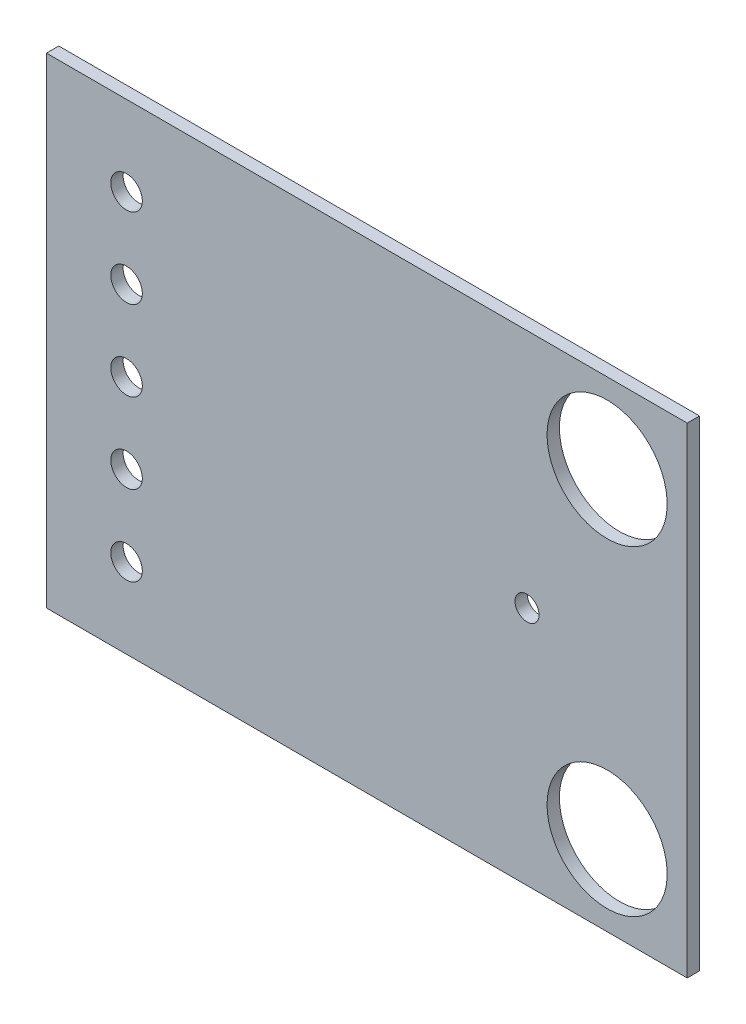
ISO-10303-21;
HEADER;
FILE_DESCRIPTION(('STEP AP214'),'2;1');
FILE_NAME('part.step','',(''),(''),'','','');
FILE_SCHEMA(('AUTOMOTIVE_DESIGN { 1 0 10303 214 1 1 1 1 }'));
ENDSEC;
DATA;
#1=APPLICATION_CONTEXT('core data for automotive mechanical design processes');
#2=APPLICATION_PROTOCOL_DEFINITION('international standard','automotive_design',2000,#1);
#3=PRODUCT_CONTEXT('',#1,'mechanical');
#4=PRODUCT('Part','Part','',(#3));
#5=PRODUCT_RELATED_PRODUCT_CATEGORY('part','',(#4));
#6=PRODUCT_DEFINITION_FORMATION('','',#4);
#7=PRODUCT_DEFINITION_CONTEXT('part definition',#1,'design');
#8=PRODUCT_DEFINITION('design','',#6,#7);
#9=PRODUCT_DEFINITION_SHAPE('','',#8);
#10=(LENGTH_UNIT() NAMED_UNIT(*) SI_UNIT(.MILLI.,.METRE.));
#11=(NAMED_UNIT(*) PLANE_ANGLE_UNIT() SI_UNIT($,.RADIAN.));
#12=(NAMED_UNIT(*) SI_UNIT($,.STERADIAN.) SOLID_ANGLE_UNIT());
#13=UNCERTAINTY_MEASURE_WITH_UNIT(LENGTH_MEASURE(1.E-05),#10,'distance_accuracy_value','');
#14=(GEOMETRIC_REPRESENTATION_CONTEXT(3) GLOBAL_UNCERTAINTY_ASSIGNED_CONTEXT((#13)) GLOBAL_UNIT_ASSIGNED_CONTEXT((#10,
#11,#12)) REPRESENTATION_CONTEXT('',''));
#15=CARTESIAN_POINT('',(0.,0.,0.));
#16=DIRECTION('',(0.,0.,1.));
#17=DIRECTION('',(1.,0.,0.));
#18=AXIS2_PLACEMENT_3D('',#15,#16,#17);
#19=CARTESIAN_POINT('',(0.,0.,0.39116));
#20=DIRECTION('',(0.,0.,-1.));
#21=DIRECTION('',(-1.,0.,0.));
#22=AXIS2_PLACEMENT_3D('',#19,#20,#21);
#23=PLANE('',#22);
#24=CARTESIAN_POINT('',(17.78,12.7,0.39116));
#25=DIRECTION('',(0.,0.,-1.));
#26=DIRECTION('',(-1.,0.,0.));
#27=AXIS2_PLACEMENT_3D('',#24,#25,#26);
#28=CIRCLE('',#27,1.905);
#29=CARTESIAN_POINT('',(15.875,12.7,0.39116));
#30=VERTEX_POINT('',#29);
#31=EDGE_CURVE('E103',#30,#30,#28,.T.);
#32=ORIENTED_EDGE('',*,*,#31,.T.);
#33=EDGE_LOOP('',(#32));
#34=FACE_BOUND('',#33,.T.);
#35=CARTESIAN_POINT('',(2.54,12.7,0.39116));
#36=DIRECTION('',(0.,0.,-1.));
#37=DIRECTION('',(-1.,0.,0.));
#38=AXIS2_PLACEMENT_3D('',#35,#36,#37);
#39=CIRCLE('',#38,0.499999);
#40=CARTESIAN_POINT('',(2.040001,12.7,0.39116));
#41=VERTEX_POINT('',#40);
#42=EDGE_CURVE('E107',#41,#41,#39,.T.);
#43=ORIENTED_EDGE('',*,*,#42,.T.);
#44=EDGE_LOOP('',(#43));
#45=FACE_BOUND('',#44,.T.);
#46=CARTESIAN_POINT('',(17.78,2.54,0.39116));
#47=DIRECTION('',(0.,0.,-1.));
#48=DIRECTION('',(-1.,0.,0.));
#49=AXIS2_PLACEMENT_3D('',#46,#47,#48);
#50=CIRCLE('',#49,1.905);
#51=CARTESIAN_POINT('',(15.875,2.54,0.39116));
#52=VERTEX_POINT('',#51);
#53=EDGE_CURVE('E110',#52,#52,#50,.T.);
#54=ORIENTED_EDGE('',*,*,#53,.T.);
#55=EDGE_LOOP('',(#54));
#56=FACE_BOUND('',#55,.T.);
#57=CARTESIAN_POINT('',(15.24,7.62,0.39116));
#58=DIRECTION('',(0.,0.,-1.));
#59=DIRECTION('',(-1.,0.,0.));
#60=AXIS2_PLACEMENT_3D('',#57,#58,#59);
#61=CIRCLE('',#60,0.381);
#62=CARTESIAN_POINT('',(14.859,7.62,0.39116));
#63=VERTEX_POINT('',#62);
#64=EDGE_CURVE('E113',#63,#63,#61,.T.);
#65=ORIENTED_EDGE('',*,*,#64,.T.);
#66=EDGE_LOOP('',(#65));
#67=FACE_BOUND('',#66,.T.);
#68=CARTESIAN_POINT('',(2.54,7.62,0.39116));
#69=DIRECTION('',(0.,0.,-1.));
#70=DIRECTION('',(-1.,0.,0.));
#71=AXIS2_PLACEMENT_3D('',#68,#69,#70);
#72=CIRCLE('',#71,0.499999);
#73=CARTESIAN_POINT('',(2.040001,7.62,0.39116));
#74=VERTEX_POINT('',#73);
#75=EDGE_CURVE('E116',#74,#74,#72,.T.);
#76=ORIENTED_EDGE('',*,*,#75,.T.);
#77=EDGE_LOOP('',(#76));
#78=FACE_BOUND('',#77,.T.);
#79=CARTESIAN_POINT('',(2.54,10.16,0.39116));
#80=DIRECTION('',(0.,0.,-1.));
#81=DIRECTION('',(-1.,0.,0.));
#82=AXIS2_PLACEMENT_3D('',#79,#80,#81);
#83=CIRCLE('',#82,0.499999);
#84=CARTESIAN_POINT('',(2.040001,10.16,0.39116));
#85=VERTEX_POINT('',#84);
#86=EDGE_CURVE('E119',#85,#85,#83,.T.);
#87=ORIENTED_EDGE('',*,*,#86,.T.);
#88=EDGE_LOOP('',(#87));
#89=FACE_BOUND('',#88,.T.);
#90=CARTESIAN_POINT('',(2.54,2.54,0.39116));
#91=DIRECTION('',(0.,0.,-1.));
#92=DIRECTION('',(-1.,0.,0.));
#93=AXIS2_PLACEMENT_3D('',#90,#91,#92);
#94=CIRCLE('',#93,0.499999);
#95=CARTESIAN_POINT('',(2.040001,2.54,0.39116));
#96=VERTEX_POINT('',#95);
#97=EDGE_CURVE('E121',#96,#96,#94,.T.);
#98=ORIENTED_EDGE('',*,*,#97,.T.);
#99=EDGE_LOOP('',(#98));
#100=FACE_BOUND('',#99,.T.);
#101=CARTESIAN_POINT('',(2.54,5.08,0.39116));
#102=DIRECTION('',(0.,0.,-1.));
#103=DIRECTION('',(-1.,0.,0.));
#104=AXIS2_PLACEMENT_3D('',#101,#102,#103);
#105=CIRCLE('',#104,0.499999);
#106=CARTESIAN_POINT('',(2.040001,5.08,0.39116));
#107=VERTEX_POINT('',#106);
#108=EDGE_CURVE('E20',#107,#107,#105,.T.);
#109=ORIENTED_EDGE('',*,*,#108,.T.);
#110=EDGE_LOOP('',(#109));
#111=FACE_BOUND('',#110,.T.);
#112=DIRECTION('',(0.,1.,0.));
#113=VECTOR('',#112,1.);
#114=CARTESIAN_POINT('',(20.32,0.,0.39116));
#115=LINE('',#114,#113);
#116=CARTESIAN_POINT('',(20.32,0.,0.39116));
#117=VERTEX_POINT('',#116);
#118=CARTESIAN_POINT('',(20.32,15.24,0.39116));
#119=VERTEX_POINT('',#118);
#120=EDGE_CURVE('E55',#117,#119,#115,.T.);
#121=ORIENTED_EDGE('',*,*,#120,.T.);
#122=DIRECTION('',(1.,0.,0.));
#123=VECTOR('',#122,1.);
#124=CARTESIAN_POINT('',(20.32,15.24,0.39116));
#125=LINE('',#124,#123);
#126=CARTESIAN_POINT('',(0.,15.24,0.39116));
#127=VERTEX_POINT('',#126);
#128=EDGE_CURVE('E57',#119,#127,#125,.F.);
#129=ORIENTED_EDGE('',*,*,#128,.T.);
#130=DIRECTION('',(0.,1.,0.));
#131=VECTOR('',#130,1.);
#132=CARTESIAN_POINT('',(0.,15.24,0.39116));
#133=LINE('',#132,#131);
#134=CARTESIAN_POINT('',(0.,0.,0.39116));
#135=VERTEX_POINT('',#134);
#136=EDGE_CURVE('E59',#127,#135,#133,.F.);
#137=ORIENTED_EDGE('',*,*,#136,.T.);
#138=DIRECTION('',(1.,0.,0.));
#139=VECTOR('',#138,1.);
#140=CARTESIAN_POINT('',(0.,0.,0.39116));
#141=LINE('',#140,#139);
#142=EDGE_CURVE('E128',#135,#117,#141,.T.);
#143=ORIENTED_EDGE('',*,*,#142,.T.);
#144=EDGE_LOOP('',(#121,#129,#137,#143));
#145=FACE_BOUND('',#144,.T.);
#146=ADVANCED_FACE('F17',(#34,#45,#56,#67,#78,#89,#100,#111,#145),#23,.F.);
#147=CARTESIAN_POINT('',(0.,15.24,0.));
#148=DIRECTION('',(1.,0.,0.));
#149=DIRECTION('',(0.,0.,-1.));
#150=AXIS2_PLACEMENT_3D('',#147,#148,#149);
#151=PLANE('',#150);
#152=DIRECTION('',(0.,0.,1.));
#153=VECTOR('',#152,1.);
#154=CARTESIAN_POINT('',(0.,0.,0.));
#155=LINE('',#154,#153);
#156=CARTESIAN_POINT('',(0.,0.,0.));
#157=VERTEX_POINT('',#156);
#158=EDGE_CURVE('E70',#157,#135,#155,.T.);
#159=ORIENTED_EDGE('',*,*,#158,.T.);
#160=ORIENTED_EDGE('',*,*,#136,.F.);
#161=DIRECTION('',(0.,0.,-1.));
#162=VECTOR('',#161,1.);
#163=CARTESIAN_POINT('',(0.,15.24,0.));
#164=LINE('',#163,#162);
#165=CARTESIAN_POINT('',(0.,15.24,0.));
#166=VERTEX_POINT('',#165);
#167=EDGE_CURVE('E64',#127,#166,#164,.T.);
#168=ORIENTED_EDGE('',*,*,#167,.T.);
#169=DIRECTION('',(0.,1.,0.));
#170=VECTOR('',#169,1.);
#171=CARTESIAN_POINT('',(0.,0.,0.));
#172=LINE('',#171,#170);
#173=EDGE_CURVE('E106',#157,#166,#172,.T.);
#174=ORIENTED_EDGE('',*,*,#173,.F.);
#175=EDGE_LOOP('',(#159,#160,#168,#174));
#176=FACE_BOUND('',#175,.T.);
#177=ADVANCED_FACE('F67',(#176),#151,.F.);
#178=CARTESIAN_POINT('',(20.32,15.24,0.));
#179=DIRECTION('',(0.,-1.,0.));
#180=DIRECTION('',(0.,0.,-1.));
#181=AXIS2_PLACEMENT_3D('',#178,#179,#180);
#182=PLANE('',#181);
#183=ORIENTED_EDGE('',*,*,#167,.F.);
#184=ORIENTED_EDGE('',*,*,#128,.F.);
#185=DIRECTION('',(0.,0.,1.));
#186=VECTOR('',#185,1.);
#187=CARTESIAN_POINT('',(20.32,15.24,0.));
#188=LINE('',#187,#186);
#189=CARTESIAN_POINT('',(20.32,15.24,0.));
#190=VERTEX_POINT('',#189);
#191=EDGE_CURVE('E78',#119,#190,#188,.F.);
#192=ORIENTED_EDGE('',*,*,#191,.T.);
#193=DIRECTION('',(-1.,0.,0.));
#194=VECTOR('',#193,1.);
#195=CARTESIAN_POINT('',(0.,15.24,0.));
#196=LINE('',#195,#194);
#197=EDGE_CURVE('E75',#166,#190,#196,.F.);
#198=ORIENTED_EDGE('',*,*,#197,.F.);
#199=EDGE_LOOP('',(#183,#184,#192,#198));
#200=FACE_BOUND('',#199,.T.);
#201=ADVANCED_FACE('F73',(#200),#182,.F.);
#202=CARTESIAN_POINT('',(20.32,0.,0.));
#203=DIRECTION('',(-1.,0.,0.));
#204=DIRECTION('',(0.,0.,1.));
#205=AXIS2_PLACEMENT_3D('',#202,#203,#204);
#206=PLANE('',#205);
#207=ORIENTED_EDGE('',*,*,#191,.F.);
#208=ORIENTED_EDGE('',*,*,#120,.F.);
#209=DIRECTION('',(0.,0.,1.));
#210=VECTOR('',#209,1.);
#211=CARTESIAN_POINT('',(20.32,0.,0.));
#212=LINE('',#211,#210);
#213=CARTESIAN_POINT('',(20.32,0.,0.));
#214=VERTEX_POINT('',#213);
#215=EDGE_CURVE('E35',#117,#214,#212,.F.);
#216=ORIENTED_EDGE('',*,*,#215,.T.);
#217=DIRECTION('',(0.,1.,0.));
#218=VECTOR('',#217,1.);
#219=CARTESIAN_POINT('',(20.32,0.,0.));
#220=LINE('',#219,#218);
#221=EDGE_CURVE('E135',#190,#214,#220,.F.);
#222=ORIENTED_EDGE('',*,*,#221,.F.);
#223=EDGE_LOOP('',(#207,#208,#216,#222));
#224=FACE_BOUND('',#223,.T.);
#225=ADVANCED_FACE('F136',(#224),#206,.F.);
#226=CARTESIAN_POINT('',(0.,0.,0.));
#227=DIRECTION('',(0.,1.,0.));
#228=DIRECTION('',(0.,0.,1.));
#229=AXIS2_PLACEMENT_3D('',#226,#227,#228);
#230=PLANE('',#229);
#231=ORIENTED_EDGE('',*,*,#215,.F.);
#232=ORIENTED_EDGE('',*,*,#142,.F.);
#233=ORIENTED_EDGE('',*,*,#158,.F.);
#234=DIRECTION('',(-1.,0.,0.));
#235=VECTOR('',#234,1.);
#236=CARTESIAN_POINT('',(0.,0.,0.));
#237=LINE('',#236,#235);
#238=EDGE_CURVE('E102',#214,#157,#237,.T.);
#239=ORIENTED_EDGE('',*,*,#238,.F.);
#240=EDGE_LOOP('',(#231,#232,#233,#239));
#241=FACE_BOUND('',#240,.T.);
#242=ADVANCED_FACE('F143',(#241),#230,.F.);
#243=CARTESIAN_POINT('',(2.54,5.08,0.));
#244=DIRECTION('',(0.,0.,-1.));
#245=DIRECTION('',(-1.,0.,0.));
#246=AXIS2_PLACEMENT_3D('',#243,#244,#245);
#247=CYLINDRICAL_SURFACE('',#246,0.499999);
#248=ORIENTED_EDGE('',*,*,#108,.F.);
#249=EDGE_LOOP('',(#248));
#250=FACE_BOUND('',#249,.T.);
#251=CARTESIAN_POINT('',(2.54,5.08,0.));
#252=DIRECTION('',(0.,0.,-1.));
#253=DIRECTION('',(-1.,0.,0.));
#254=AXIS2_PLACEMENT_3D('',#251,#252,#253);
#255=CIRCLE('',#254,0.499999);
#256=CARTESIAN_POINT('',(2.040001,5.08,0.));
#257=VERTEX_POINT('',#256);
#258=EDGE_CURVE('E99',#257,#257,#255,.F.);
#259=ORIENTED_EDGE('',*,*,#258,.F.);
#260=EDGE_LOOP('',(#259));
#261=FACE_BOUND('',#260,.T.);
#262=ADVANCED_FACE('F145',(#250,#261),#247,.F.);
#263=CARTESIAN_POINT('',(2.54,2.54,0.));
#264=DIRECTION('',(0.,0.,-1.));
#265=DIRECTION('',(-1.,0.,0.));
#266=AXIS2_PLACEMENT_3D('',#263,#264,#265);
#267=CYLINDRICAL_SURFACE('',#266,0.499999);
#268=ORIENTED_EDGE('',*,*,#97,.F.);
#269=EDGE_LOOP('',(#268));
#270=FACE_BOUND('',#269,.T.);
#271=CARTESIAN_POINT('',(2.54,2.54,0.));
#272=DIRECTION('',(0.,0.,-1.));
#273=DIRECTION('',(-1.,0.,0.));
#274=AXIS2_PLACEMENT_3D('',#271,#272,#273);
#275=CIRCLE('',#274,0.499999);
#276=CARTESIAN_POINT('',(2.040001,2.54,0.));
#277=VERTEX_POINT('',#276);
#278=EDGE_CURVE('E96',#277,#277,#275,.F.);
#279=ORIENTED_EDGE('',*,*,#278,.F.);
#280=EDGE_LOOP('',(#279));
#281=FACE_BOUND('',#280,.T.);
#282=ADVANCED_FACE('F152',(#270,#281),#267,.F.);
#283=CARTESIAN_POINT('',(2.54,10.16,0.));
#284=DIRECTION('',(0.,0.,-1.));
#285=DIRECTION('',(-1.,0.,0.));
#286=AXIS2_PLACEMENT_3D('',#283,#284,#285);
#287=CYLINDRICAL_SURFACE('',#286,0.499999);
#288=ORIENTED_EDGE('',*,*,#86,.F.);
#289=EDGE_LOOP('',(#288));
#290=FACE_BOUND('',#289,.T.);
#291=CARTESIAN_POINT('',(2.54,10.16,0.));
#292=DIRECTION('',(0.,0.,-1.));
#293=DIRECTION('',(-1.,0.,0.));
#294=AXIS2_PLACEMENT_3D('',#291,#292,#293);
#295=CIRCLE('',#294,0.499999);
#296=CARTESIAN_POINT('',(2.040001,10.16,0.));
#297=VERTEX_POINT('',#296);
#298=EDGE_CURVE('E93',#297,#297,#295,.F.);
#299=ORIENTED_EDGE('',*,*,#298,.F.);
#300=EDGE_LOOP('',(#299));
#301=FACE_BOUND('',#300,.T.);
#302=ADVANCED_FACE('F182',(#290,#301),#287,.F.);
#303=CARTESIAN_POINT('',(2.54,7.62,0.));
#304=DIRECTION('',(0.,0.,-1.));
#305=DIRECTION('',(-1.,0.,0.));
#306=AXIS2_PLACEMENT_3D('',#303,#304,#305);
#307=CYLINDRICAL_SURFACE('',#306,0.499999);
#308=ORIENTED_EDGE('',*,*,#75,.F.);
#309=EDGE_LOOP('',(#308));
#310=FACE_BOUND('',#309,.T.);
#311=CARTESIAN_POINT('',(2.54,7.62,0.));
#312=DIRECTION('',(0.,0.,-1.));
#313=DIRECTION('',(-1.,0.,0.));
#314=AXIS2_PLACEMENT_3D('',#311,#312,#313);
#315=CIRCLE('',#314,0.499999);
#316=CARTESIAN_POINT('',(2.040001,7.62,0.));
#317=VERTEX_POINT('',#316);
#318=EDGE_CURVE('E90',#317,#317,#315,.F.);
#319=ORIENTED_EDGE('',*,*,#318,.F.);
#320=EDGE_LOOP('',(#319));
#321=FACE_BOUND('',#320,.T.);
#322=ADVANCED_FACE('F178',(#310,#321),#307,.F.);
#323=CARTESIAN_POINT('',(15.24,7.62,0.));
#324=DIRECTION('',(0.,0.,-1.));
#325=DIRECTION('',(-1.,0.,0.));
#326=AXIS2_PLACEMENT_3D('',#323,#324,#325);
#327=CYLINDRICAL_SURFACE('',#326,0.381);
#328=ORIENTED_EDGE('',*,*,#64,.F.);
#329=EDGE_LOOP('',(#328));
#330=FACE_BOUND('',#329,.T.);
#331=CARTESIAN_POINT('',(15.24,7.62,0.));
#332=DIRECTION('',(0.,0.,-1.));
#333=DIRECTION('',(-1.,0.,0.));
#334=AXIS2_PLACEMENT_3D('',#331,#332,#333);
#335=CIRCLE('',#334,0.381);
#336=CARTESIAN_POINT('',(14.859,7.62,0.));
#337=VERTEX_POINT('',#336);
#338=EDGE_CURVE('E87',#337,#337,#335,.F.);
#339=ORIENTED_EDGE('',*,*,#338,.F.);
#340=EDGE_LOOP('',(#339));
#341=FACE_BOUND('',#340,.T.);
#342=ADVANCED_FACE('F174',(#330,#341),#327,.F.);
#343=CARTESIAN_POINT('',(17.78,2.54,0.));
#344=DIRECTION('',(0.,0.,-1.));
#345=DIRECTION('',(-1.,0.,0.));
#346=AXIS2_PLACEMENT_3D('',#343,#344,#345);
#347=CYLINDRICAL_SURFACE('',#346,1.905);
#348=ORIENTED_EDGE('',*,*,#53,.F.);
#349=EDGE_LOOP('',(#348));
#350=FACE_BOUND('',#349,.T.);
#351=CARTESIAN_POINT('',(17.78,2.54,0.));
#352=DIRECTION('',(0.,0.,-1.));
#353=DIRECTION('',(-1.,0.,0.));
#354=AXIS2_PLACEMENT_3D('',#351,#352,#353);
#355=CIRCLE('',#354,1.905);
#356=CARTESIAN_POINT('',(15.875,2.54,0.));
#357=VERTEX_POINT('',#356);
#358=EDGE_CURVE('E84',#357,#357,#355,.F.);
#359=ORIENTED_EDGE('',*,*,#358,.F.);
#360=EDGE_LOOP('',(#359));
#361=FACE_BOUND('',#360,.T.);
#362=ADVANCED_FACE('F170',(#350,#361),#347,.F.);
#363=CARTESIAN_POINT('',(2.54,12.7,0.));
#364=DIRECTION('',(0.,0.,-1.));
#365=DIRECTION('',(-1.,0.,0.));
#366=AXIS2_PLACEMENT_3D('',#363,#364,#365);
#367=CYLINDRICAL_SURFACE('',#366,0.499999);
#368=ORIENTED_EDGE('',*,*,#42,.F.);
#369=EDGE_LOOP('',(#368));
#370=FACE_BOUND('',#369,.T.);
#371=CARTESIAN_POINT('',(2.54,12.7,0.));
#372=DIRECTION('',(0.,0.,-1.));
#373=DIRECTION('',(-1.,0.,0.));
#374=AXIS2_PLACEMENT_3D('',#371,#372,#373);
#375=CIRCLE('',#374,0.499999);
#376=CARTESIAN_POINT('',(2.040001,12.7,0.));
#377=VERTEX_POINT('',#376);
#378=EDGE_CURVE('E26',#377,#377,#375,.F.);
#379=ORIENTED_EDGE('',*,*,#378,.F.);
#380=EDGE_LOOP('',(#379));
#381=FACE_BOUND('',#380,.T.);
#382=ADVANCED_FACE('F163',(#370,#381),#367,.F.);
#383=CARTESIAN_POINT('',(17.78,12.7,0.));
#384=DIRECTION('',(0.,0.,-1.));
#385=DIRECTION('',(-1.,0.,0.));
#386=AXIS2_PLACEMENT_3D('',#383,#384,#385);
#387=CYLINDRICAL_SURFACE('',#386,1.905);
#388=ORIENTED_EDGE('',*,*,#31,.F.);
#389=EDGE_LOOP('',(#388));
#390=FACE_BOUND('',#389,.T.);
#391=CARTESIAN_POINT('',(17.78,12.7,0.));
#392=DIRECTION('',(0.,0.,-1.));
#393=DIRECTION('',(-1.,0.,0.));
#394=AXIS2_PLACEMENT_3D('',#391,#392,#393);
#395=CIRCLE('',#394,1.905);
#396=CARTESIAN_POINT('',(15.875,12.7,0.));
#397=VERTEX_POINT('',#396);
#398=EDGE_CURVE('E11',#397,#397,#395,.F.);
#399=ORIENTED_EDGE('',*,*,#398,.F.);
#400=EDGE_LOOP('',(#399));
#401=FACE_BOUND('',#400,.T.);
#402=ADVANCED_FACE('F157',(#390,#401),#387,.F.);
#403=CARTESIAN_POINT('',(0.,0.,0.));
#404=DIRECTION('',(0.,0.,-1.));
#405=DIRECTION('',(-1.,0.,0.));
#406=AXIS2_PLACEMENT_3D('',#403,#404,#405);
#407=PLANE('',#406);
#408=ORIENTED_EDGE('',*,*,#398,.T.);
#409=EDGE_LOOP('',(#408));
#410=FACE_BOUND('',#409,.T.);
#411=ORIENTED_EDGE('',*,*,#378,.T.);
#412=EDGE_LOOP('',(#411));
#413=FACE_BOUND('',#412,.T.);
#414=ORIENTED_EDGE('',*,*,#358,.T.);
#415=EDGE_LOOP('',(#414));
#416=FACE_BOUND('',#415,.T.);
#417=ORIENTED_EDGE('',*,*,#338,.T.);
#418=EDGE_LOOP('',(#417));
#419=FACE_BOUND('',#418,.T.);
#420=ORIENTED_EDGE('',*,*,#318,.T.);
#421=EDGE_LOOP('',(#420));
#422=FACE_BOUND('',#421,.T.);
#423=ORIENTED_EDGE('',*,*,#298,.T.);
#424=EDGE_LOOP('',(#423));
#425=FACE_BOUND('',#424,.T.);
#426=ORIENTED_EDGE('',*,*,#278,.T.);
#427=EDGE_LOOP('',(#426));
#428=FACE_BOUND('',#427,.T.);
#429=ORIENTED_EDGE('',*,*,#258,.T.);
#430=EDGE_LOOP('',(#429));
#431=FACE_BOUND('',#430,.T.);
#432=ORIENTED_EDGE('',*,*,#221,.T.);
#433=ORIENTED_EDGE('',*,*,#238,.T.);
#434=ORIENTED_EDGE('',*,*,#173,.T.);
#435=ORIENTED_EDGE('',*,*,#197,.T.);
#436=EDGE_LOOP('',(#432,#433,#434,#435));
#437=FACE_BOUND('',#436,.T.);
#438=ADVANCED_FACE('F140',(#410,#413,#416,#419,#422,#425,#428,#431,#437),#407,.T.);
#439=CLOSED_SHELL('',(#146,#177,#201,#225,#242,#262,#282,#302,#322,#342,#362,#382,#402,#438));
#440=MANIFOLD_SOLID_BREP('B1',#439);
#441=ADVANCED_BREP_SHAPE_REPRESENTATION('',(#18,#440),#14);
#442=SHAPE_DEFINITION_REPRESENTATION(#9,#441);
ENDSEC;
END-ISO-10303-21;
